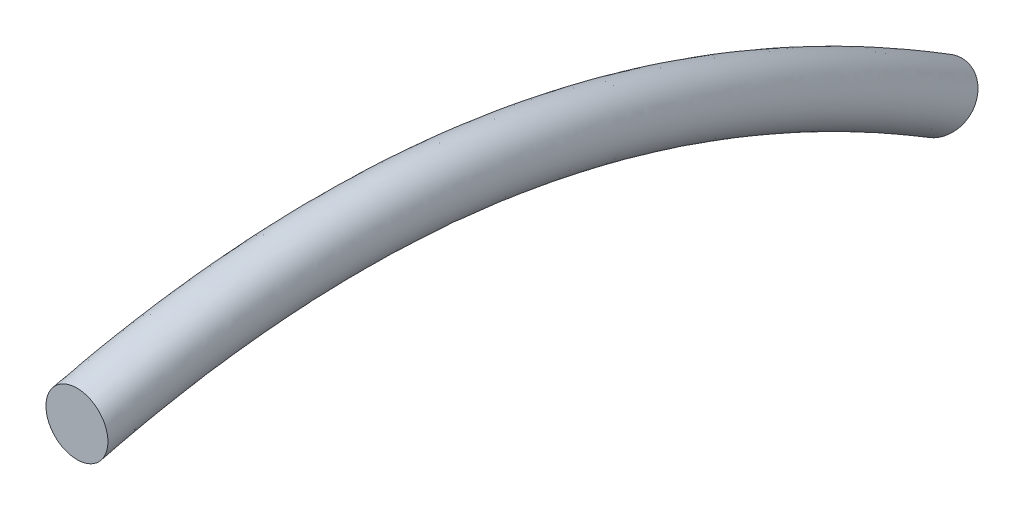
ISO-10303-21;
HEADER;
FILE_DESCRIPTION(('STEP AP214'),'2;1');
FILE_NAME('part.step','',(''),(''),'','','');
FILE_SCHEMA(('AUTOMOTIVE_DESIGN { 1 0 10303 214 1 1 1 1 }'));
ENDSEC;
DATA;
#1=APPLICATION_CONTEXT('core data for automotive mechanical design processes');
#2=APPLICATION_PROTOCOL_DEFINITION('international standard','automotive_design',2000,#1);
#3=PRODUCT_CONTEXT('',#1,'mechanical');
#4=PRODUCT('Part','Part','',(#3));
#5=PRODUCT_RELATED_PRODUCT_CATEGORY('part','',(#4));
#6=PRODUCT_DEFINITION_FORMATION('','',#4);
#7=PRODUCT_DEFINITION_CONTEXT('part definition',#1,'design');
#8=PRODUCT_DEFINITION('design','',#6,#7);
#9=PRODUCT_DEFINITION_SHAPE('','',#8);
#10=(LENGTH_UNIT() NAMED_UNIT(*) SI_UNIT(.MILLI.,.METRE.));
#11=(NAMED_UNIT(*) PLANE_ANGLE_UNIT() SI_UNIT($,.RADIAN.));
#12=(NAMED_UNIT(*) SI_UNIT($,.STERADIAN.) SOLID_ANGLE_UNIT());
#13=UNCERTAINTY_MEASURE_WITH_UNIT(LENGTH_MEASURE(1.E-05),#10,'distance_accuracy_value','');
#14=(GEOMETRIC_REPRESENTATION_CONTEXT(3) GLOBAL_UNCERTAINTY_ASSIGNED_CONTEXT((#13)) GLOBAL_UNIT_ASSIGNED_CONTEXT((#10,
#11,#12)) REPRESENTATION_CONTEXT('',''));
#15=CARTESIAN_POINT('',(0.,0.,0.));
#16=DIRECTION('',(0.,0.,1.));
#17=DIRECTION('',(1.,0.,0.));
#18=AXIS2_PLACEMENT_3D('',#15,#16,#17);
#19=CARTESIAN_POINT('',(0.,0.,0.));
#20=DIRECTION('',(0.,0.,1.));
#21=DIRECTION('',(1.,0.,0.));
#22=AXIS2_PLACEMENT_3D('',#19,#20,#21);
#23=PLANE('',#22);
#24=CARTESIAN_POINT('',(0.,0.,0.));
#25=DIRECTION('',(0.,0.,1.));
#26=DIRECTION('',(1.,0.,0.));
#27=AXIS2_PLACEMENT_3D('',#24,#25,#26);
#28=CIRCLE('',#27,120.);
#29=CARTESIAN_POINT('',(120.,0.,0.));
#30=VERTEX_POINT('',#29);
#31=EDGE_CURVE('E42',#30,#30,#28,.T.);
#32=ORIENTED_EDGE('',*,*,#31,.T.);
#33=EDGE_LOOP('',(#32));
#34=FACE_BOUND('',#33,.T.);
#35=ADVANCED_FACE('F35',(#34),#23,.T.);
#36=CARTESIAN_POINT('',(0.,-571.106965416793,-3340.63642362333));
#37=DIRECTION('',(0.,0.715214984728373,0.698904518242652));
#38=DIRECTION('',(1.,0.,0.));
#39=AXIS2_PLACEMENT_3D('',#36,#37,#38);
#40=PLANE('',#39);
#41=CARTESIAN_POINT('',(0.,-571.106965416793,-3340.63642362333));
#42=DIRECTION('',(0.,0.715214984728373,0.698904518242652));
#43=DIRECTION('',(1.,0.,0.));
#44=AXIS2_PLACEMENT_3D('',#41,#42,#43);
#45=CIRCLE('',#44,120.);
#46=CARTESIAN_POINT('',(120.,-571.106965416793,-3340.63642362333));
#47=VERTEX_POINT('',#46);
#48=EDGE_CURVE('E11',#47,#47,#45,.T.);
#49=ORIENTED_EDGE('',*,*,#48,.F.);
#50=EDGE_LOOP('',(#49));
#51=FACE_BOUND('',#50,.T.);
#52=ADVANCED_FACE('F51',(#51),#40,.F.);
#53=CARTESIAN_POINT('',(120.,0.,0.));
#54=CARTESIAN_POINT('',(120.,35.7975437076088,-142.746213587051));
#55=CARTESIAN_POINT('',(120.,64.1458790068516,-285.048298516149));
#56=CARTESIAN_POINT('',(120.,105.94413278882,-568.764211054098));
#57=CARTESIAN_POINT('',(120.,119.394051270089,-710.178038656074));
#58=CARTESIAN_POINT('',(120.,131.395471421291,-992.117436580301));
#59=CARTESIAN_POINT('',(120.,129.94697308348,-1132.64300687556));
#60=CARTESIAN_POINT('',(120.,112.151559603646,-1412.80589012283));
#61=CARTESIAN_POINT('',(120.,95.804644449615,-1552.44320309257));
#62=CARTESIAN_POINT('',(120.,48.2123973332939,-1830.8295717637));
#63=CARTESIAN_POINT('',(120.,16.9670653627189,-1969.57862738961));
#64=CARTESIAN_POINT('',(120.,-60.4220153839896,-2246.18848142044));
#65=CARTESIAN_POINT('',(120.,-106.565764173153,-2384.04927977704));
#66=CARTESIAN_POINT('',(120.,-267.344635741813,-2796.29928873547));
#67=CARTESIAN_POINT('',(120.,-404.327383745627,-3069.35611337448));
#68=CARTESIAN_POINT('',(120.,-571.106965416793,-3340.63642362333));
#69=CARTESIAN_POINT('',(120.,240.,0.));
#70=CARTESIAN_POINT('',(120.,275.797543707609,-150.484325760288));
#71=CARTESIAN_POINT('',(120.,303.769503571954,-300.763259923064));
#72=CARTESIAN_POINT('',(120.,343.949353475771,-600.700967173308));
#73=CARTESIAN_POINT('',(120.,356.156320586504,-750.358785006287));
#74=CARTESIAN_POINT('',(120.,364.760633270629,-1048.78811492529));
#75=CARTESIAN_POINT('',(120.,361.157663944508,-1197.55813719584));
#76=CARTESIAN_POINT('',(120.,338.186272717905,-1493.9271954735));
#77=CARTESIAN_POINT('',(120.,318.81836119651,-1641.52471436225));
#78=CARTESIAN_POINT('',(120.,264.448519389889,-1935.29283337903));
#79=CARTESIAN_POINT('',(120.,229.447732957253,-2081.46244579875));
#80=CARTESIAN_POINT('',(120.,144.004894223235,-2372.18713834683));
#81=CARTESIAN_POINT('',(120.,93.5641395898453,-2516.74202240492));
#82=CARTESIAN_POINT('',(120.,-80.5968070755763,-2947.83350204529));
#83=CARTESIAN_POINT('',(120.,-227.134357603759,-3231.76741072496));
#84=CARTESIAN_POINT('',(120.,-403.369881038556,-3512.28801995814));
#85=CARTESIAN_POINT('',(-120.,240.,0.));
#86=CARTESIAN_POINT('',(-120.,275.797543707609,-150.484325760288));
#87=CARTESIAN_POINT('',(-120.,303.769503571954,-300.763259925053));
#88=CARTESIAN_POINT('',(-120.,343.949353475771,-600.700967171318));
#89=CARTESIAN_POINT('',(-120.,356.156320586504,-750.358785006287));
#90=CARTESIAN_POINT('',(-120.,364.760633270629,-1048.78811492529));
#91=CARTESIAN_POINT('',(-120.,361.157663944508,-1197.55813719584));
#92=CARTESIAN_POINT('',(-120.,338.186272717905,-1493.9271954735));
#93=CARTESIAN_POINT('',(-120.,318.81836119651,-1641.52471437008));
#94=CARTESIAN_POINT('',(-120.,264.448519389889,-1935.2928333712));
#95=CARTESIAN_POINT('',(-120.,229.447732957253,-2081.46244579875));
#96=CARTESIAN_POINT('',(-120.,144.004894223235,-2372.18713834683));
#97=CARTESIAN_POINT('',(-120.,93.5641395898452,-2516.74202240492));
#98=CARTESIAN_POINT('',(-120.,-80.5968070755763,-2947.83350204529));
#99=CARTESIAN_POINT('',(-120.,-227.134357568405,-3231.76741072496));
#100=CARTESIAN_POINT('',(-120.,-403.369881038556,-3512.28801995814));
#101=CARTESIAN_POINT('',(-120.,0.,0.));
#102=CARTESIAN_POINT('',(-120.,35.7975437076088,-142.746213587051));
#103=CARTESIAN_POINT('',(-120.,64.1458790068516,-285.048298516149));
#104=CARTESIAN_POINT('',(-120.,105.94413278882,-568.764211054098));
#105=CARTESIAN_POINT('',(-120.,119.394051270089,-710.178038656074));
#106=CARTESIAN_POINT('',(-120.,131.395471421291,-992.117436580301));
#107=CARTESIAN_POINT('',(-120.,129.94697308348,-1132.64300687556));
#108=CARTESIAN_POINT('',(-120.,112.151559603646,-1412.80589012283));
#109=CARTESIAN_POINT('',(-120.,95.804644449615,-1552.44320309257));
#110=CARTESIAN_POINT('',(-120.,48.2123973332939,-1830.8295717637));
#111=CARTESIAN_POINT('',(-120.,16.9670653627189,-1969.57862738961));
#112=CARTESIAN_POINT('',(-120.,-60.4220153839896,-2246.18848142044));
#113=CARTESIAN_POINT('',(-120.,-106.565764173153,-2384.04927977704));
#114=CARTESIAN_POINT('',(-120.,-267.344635741813,-2796.29928873547));
#115=CARTESIAN_POINT('',(-120.,-404.327383745627,-3069.35611337448));
#116=CARTESIAN_POINT('',(-120.,-571.106965416793,-3340.63642362333));
#117=CARTESIAN_POINT('',(-120.,-240.,0.));
#118=CARTESIAN_POINT('',(-120.,-204.202456292391,-135.008101413814));
#119=CARTESIAN_POINT('',(-120.,-175.477745558251,-269.333337107244));
#120=CARTESIAN_POINT('',(-120.,-132.061087898132,-536.827454936877));
#121=CARTESIAN_POINT('',(-120.,-117.368218046326,-669.99729230586));
#122=CARTESIAN_POINT('',(-120.,-101.969690428048,-935.446758235317));
#123=CARTESIAN_POINT('',(-120.,-101.263717777548,-1067.72787655528));
#124=CARTESIAN_POINT('',(-120.,-113.883153510614,-1331.68458477216));
#125=CARTESIAN_POINT('',(-120.,-127.20907229728,-1463.36169181506));
#126=CARTESIAN_POINT('',(-120.,-168.023724723301,-1726.36631015621));
#127=CARTESIAN_POINT('',(-120.,-195.513602231815,-1857.69480898046));
#128=CARTESIAN_POINT('',(-120.,-264.848924991214,-2120.18982449406));
#129=CARTESIAN_POINT('',(-120.,-306.695667936152,-2251.35653714917));
#130=CARTESIAN_POINT('',(-120.,-454.092464408049,-2644.76507542565));
#131=CARTESIAN_POINT('',(-120.,-581.520409922849,-2906.94481602399));
#132=CARTESIAN_POINT('',(-120.,-738.844049795029,-3168.98482728852));
#133=CARTESIAN_POINT('',(120.,-240.,0.));
#134=CARTESIAN_POINT('',(120.,-204.202456292391,-135.008101413814));
#135=CARTESIAN_POINT('',(120.,-175.477745558251,-269.333337109234));
#136=CARTESIAN_POINT('',(120.,-132.061087898132,-536.827454934887));
#137=CARTESIAN_POINT('',(120.,-117.368218046326,-669.99729230586));
#138=CARTESIAN_POINT('',(120.,-101.969690428048,-935.446758235317));
#139=CARTESIAN_POINT('',(120.,-101.263717777548,-1067.72787655528));
#140=CARTESIAN_POINT('',(120.,-113.883153510614,-1331.68458477216));
#141=CARTESIAN_POINT('',(120.,-127.20907229728,-1463.3616918229));
#142=CARTESIAN_POINT('',(120.,-168.023724723302,-1726.36631014837));
#143=CARTESIAN_POINT('',(120.,-195.513602231815,-1857.69480898046));
#144=CARTESIAN_POINT('',(120.,-264.848924991214,-2120.18982449406));
#145=CARTESIAN_POINT('',(120.,-306.695667936152,-2251.35653714917));
#146=CARTESIAN_POINT('',(120.,-454.092464408049,-2644.76507542565));
#147=CARTESIAN_POINT('',(120.,-581.520409887495,-2906.94481602399));
#148=CARTESIAN_POINT('',(120.,-738.844049795029,-3168.98482728852));
#149=CARTESIAN_POINT('',(120.,0.,0.));
#150=CARTESIAN_POINT('',(120.,35.7975437076088,-142.746213587051));
#151=CARTESIAN_POINT('',(120.,64.1458790068516,-285.048298516149));
#152=CARTESIAN_POINT('',(120.,105.94413278882,-568.764211054098));
#153=CARTESIAN_POINT('',(120.,119.394051270089,-710.178038656074));
#154=CARTESIAN_POINT('',(120.,131.395471421291,-992.117436580301));
#155=CARTESIAN_POINT('',(120.,129.94697308348,-1132.64300687556));
#156=CARTESIAN_POINT('',(120.,112.151559603646,-1412.80589012283));
#157=CARTESIAN_POINT('',(120.,95.804644449615,-1552.44320309257));
#158=CARTESIAN_POINT('',(120.,48.2123973332939,-1830.8295717637));
#159=CARTESIAN_POINT('',(120.,16.9670653627189,-1969.57862738961));
#160=CARTESIAN_POINT('',(120.,-60.4220153839896,-2246.18848142044));
#161=CARTESIAN_POINT('',(120.,-106.565764173153,-2384.04927977704));
#162=CARTESIAN_POINT('',(120.,-267.344635741813,-2796.29928873547));
#163=CARTESIAN_POINT('',(120.,-404.327383745627,-3069.35611337448));
#164=CARTESIAN_POINT('',(120.,-571.106965416793,-3340.63642362333));
#165=(BOUNDED_SURFACE() B_SPLINE_SURFACE(3,3,((#53,#54,#55,#56,#57,#58,#59,#60,#61,#62,#63,#64,
#65,#66,#67,#68),(#69,#70,#71,#72,#73,#74,#75,#76,#77,#78,#79,#80,#81,#82,#83,#84),(#85,#86,#87,
#88,#89,#90,#91,#92,#93,#94,#95,#96,#97,#98,#99,#100),(#101,#102,#103,#104,#105,#106,#107,#108,
#109,#110,#111,#112,#113,#114,#115,#116),(#117,#118,#119,#120,#121,#122,#123,#124,#125,#126,
#127,#128,#129,#130,#131,#132),(#133,#134,#135,#136,#137,#138,#139,#140,#141,#142,#143,#144,
#145,#146,#147,#148),(#149,#150,#151,#152,#153,#154,#155,#156,#157,#158,#159,#160,#161,#162,
#163,#164)),.UNSPECIFIED.,.T.,.F.,.F.) B_SPLINE_SURFACE_WITH_KNOTS((4,3,4),(4,2,2,2,2,2,2,4),
(0.,0.5,1.),(0.,0.125,0.25,0.375,0.5,0.625,0.75,1.),
.UNSPECIFIED.) GEOMETRIC_REPRESENTATION_ITEM() RATIONAL_B_SPLINE_SURFACE(((1.,1.,1.,1.,1.,1.,1.,
1.,1.,1.,1.,1.,1.,1.,1.,1.),(0.333333333333333,0.333333333333333,0.333333333333333,
0.333333333333333,0.333333333333333,0.333333333333333,0.333333333333333,0.333333333333333,
0.333333333333333,0.333333333333333,0.333333333333333,0.333333333333333,0.333333333333333,
0.333333333333333,0.333333333333333,0.333333333333333),(0.333333333333333,0.333333333333333,
0.333333333333333,0.333333333333333,0.333333333333333,0.333333333333333,0.333333333333333,
0.333333333333333,0.333333333333333,0.333333333333333,0.333333333333333,0.333333333333333,
0.333333333333333,0.333333333333333,0.333333333333333,0.333333333333333),(1.,1.,1.,1.,1.,1.,1.,
1.,1.,1.,1.,1.,1.,1.,1.,1.),(0.333333333333333,0.333333333333333,0.333333333333333,
0.333333333333333,0.333333333333333,0.333333333333333,0.333333333333333,0.333333333333333,
0.333333333333333,0.333333333333333,0.333333333333333,0.333333333333333,0.333333333333333,
0.333333333333333,0.333333333333333,0.333333333333333),(0.333333333333333,0.333333333333333,
0.333333333333333,0.333333333333333,0.333333333333333,0.333333333333333,0.333333333333333,
0.333333333333333,0.333333333333333,0.333333333333333,0.333333333333333,0.333333333333333,
0.333333333333333,0.333333333333333,0.333333333333333,0.333333333333333),(1.,1.,1.,1.,1.,1.,1.,
1.,1.,1.,1.,1.,1.,1.,1.,1.))) REPRESENTATION_ITEM('') SURFACE());
#166=ORIENTED_EDGE('',*,*,#48,.T.);
#167=EDGE_LOOP('',(#166));
#168=FACE_BOUND('',#167,.T.);
#169=ORIENTED_EDGE('',*,*,#31,.F.);
#170=EDGE_LOOP('',(#169));
#171=FACE_BOUND('',#170,.T.);
#172=ADVANCED_FACE('F49',(#168,#171),#165,.F.);
#173=CLOSED_SHELL('',(#35,#52,#172));
#174=MANIFOLD_SOLID_BREP('B2',#173);
#175=ADVANCED_BREP_SHAPE_REPRESENTATION('',(#18,#174),#14);
#176=SHAPE_DEFINITION_REPRESENTATION(#9,#175);
ENDSEC;
END-ISO-10303-21;
